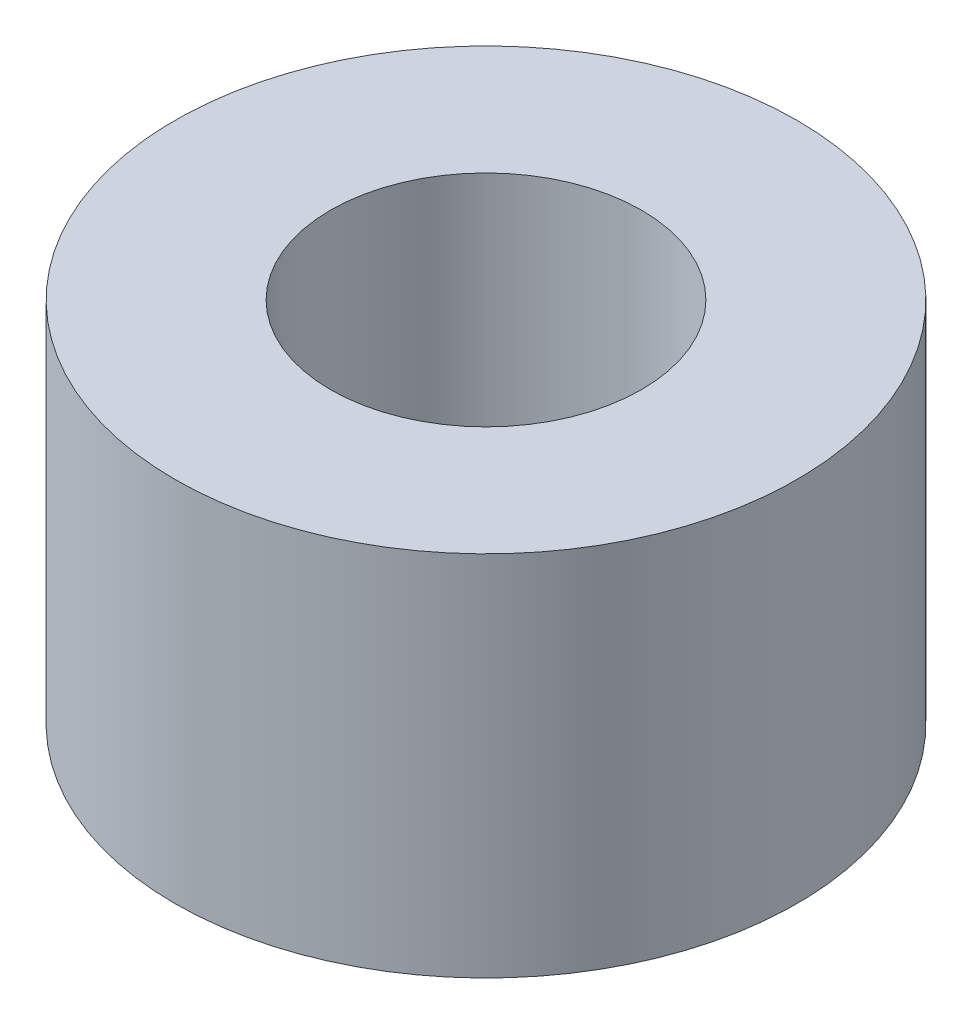
ISO-10303-21;
HEADER;
FILE_DESCRIPTION(('STEP AP214'),'2;1');
FILE_NAME('part.step','',(''),(''),'','','');
FILE_SCHEMA(('AUTOMOTIVE_DESIGN { 1 0 10303 214 1 1 1 1 }'));
ENDSEC;
DATA;
#1=APPLICATION_CONTEXT('core data for automotive mechanical design processes');
#2=APPLICATION_PROTOCOL_DEFINITION('international standard','automotive_design',2000,#1);
#3=PRODUCT_CONTEXT('',#1,'mechanical');
#4=PRODUCT('Part','Part','',(#3));
#5=PRODUCT_RELATED_PRODUCT_CATEGORY('part','',(#4));
#6=PRODUCT_DEFINITION_FORMATION('','',#4);
#7=PRODUCT_DEFINITION_CONTEXT('part definition',#1,'design');
#8=PRODUCT_DEFINITION('design','',#6,#7);
#9=PRODUCT_DEFINITION_SHAPE('','',#8);
#10=(LENGTH_UNIT() NAMED_UNIT(*) SI_UNIT(.MILLI.,.METRE.));
#11=(NAMED_UNIT(*) PLANE_ANGLE_UNIT() SI_UNIT($,.RADIAN.));
#12=(NAMED_UNIT(*) SI_UNIT($,.STERADIAN.) SOLID_ANGLE_UNIT());
#13=UNCERTAINTY_MEASURE_WITH_UNIT(LENGTH_MEASURE(1.E-05),#10,'distance_accuracy_value','');
#14=(GEOMETRIC_REPRESENTATION_CONTEXT(3) GLOBAL_UNCERTAINTY_ASSIGNED_CONTEXT((#13)) GLOBAL_UNIT_ASSIGNED_CONTEXT((#10,
#11,#12)) REPRESENTATION_CONTEXT('',''));
#15=CARTESIAN_POINT('',(0.,0.,0.));
#16=DIRECTION('',(0.,0.,1.));
#17=DIRECTION('',(1.,0.,0.));
#18=AXIS2_PLACEMENT_3D('',#15,#16,#17);
#19=CARTESIAN_POINT('',(0.,15.,0.));
#20=DIRECTION('',(0.,1.,0.));
#21=DIRECTION('',(0.,0.,1.));
#22=AXIS2_PLACEMENT_3D('',#19,#20,#21);
#23=PLANE('',#22);
#24=CARTESIAN_POINT('',(0.,15.,0.));
#25=DIRECTION('',(0.,1.,0.));
#26=DIRECTION('',(0.,0.,1.));
#27=AXIS2_PLACEMENT_3D('',#24,#25,#26);
#28=CIRCLE('',#27,12.7);
#29=CARTESIAN_POINT('',(0.,15.,12.7));
#30=VERTEX_POINT('',#29);
#31=EDGE_CURVE('E10',#30,#30,#28,.T.);
#32=ORIENTED_EDGE('',*,*,#31,.T.);
#33=EDGE_LOOP('',(#32));
#34=FACE_BOUND('',#33,.T.);
#35=CARTESIAN_POINT('',(0.,15.,0.));
#36=DIRECTION('',(0.,1.,0.));
#37=DIRECTION('',(0.,0.,1.));
#38=AXIS2_PLACEMENT_3D('',#35,#36,#37);
#39=CIRCLE('',#38,6.35);
#40=CARTESIAN_POINT('',(0.,15.,6.35));
#41=VERTEX_POINT('',#40);
#42=EDGE_CURVE('E56',#41,#41,#39,.T.);
#43=ORIENTED_EDGE('',*,*,#42,.F.);
#44=EDGE_LOOP('',(#43));
#45=FACE_BOUND('',#44,.T.);
#46=ADVANCED_FACE('F43',(#34,#45),#23,.T.);
#47=CARTESIAN_POINT('',(0.,0.,0.));
#48=DIRECTION('',(0.,1.,0.));
#49=DIRECTION('',(0.,0.,1.));
#50=AXIS2_PLACEMENT_3D('',#47,#48,#49);
#51=PLANE('',#50);
#52=CARTESIAN_POINT('',(0.,0.,0.));
#53=DIRECTION('',(0.,1.,0.));
#54=DIRECTION('',(0.,0.,1.));
#55=AXIS2_PLACEMENT_3D('',#52,#53,#54);
#56=CIRCLE('',#55,12.7);
#57=CARTESIAN_POINT('',(0.,0.,12.7));
#58=VERTEX_POINT('',#57);
#59=EDGE_CURVE('E47',#58,#58,#56,.T.);
#60=ORIENTED_EDGE('',*,*,#59,.F.);
#61=EDGE_LOOP('',(#60));
#62=FACE_BOUND('',#61,.T.);
#63=CARTESIAN_POINT('',(0.,0.,0.));
#64=DIRECTION('',(0.,1.,0.));
#65=DIRECTION('',(0.,0.,1.));
#66=AXIS2_PLACEMENT_3D('',#63,#64,#65);
#67=CIRCLE('',#66,6.35);
#68=CARTESIAN_POINT('',(0.,0.,6.35));
#69=VERTEX_POINT('',#68);
#70=EDGE_CURVE('E58',#69,#69,#67,.T.);
#71=ORIENTED_EDGE('',*,*,#70,.T.);
#72=EDGE_LOOP('',(#71));
#73=FACE_BOUND('',#72,.T.);
#74=ADVANCED_FACE('F70',(#62,#73),#51,.F.);
#75=CARTESIAN_POINT('',(0.,15.,0.));
#76=DIRECTION('',(0.,-1.,0.));
#77=DIRECTION('',(0.,0.,-1.));
#78=AXIS2_PLACEMENT_3D('',#75,#76,#77);
#79=CYLINDRICAL_SURFACE('',#78,12.7);
#80=ORIENTED_EDGE('',*,*,#31,.F.);
#81=EDGE_LOOP('',(#80));
#82=FACE_BOUND('',#81,.T.);
#83=ORIENTED_EDGE('',*,*,#59,.T.);
#84=EDGE_LOOP('',(#83));
#85=FACE_BOUND('',#84,.T.);
#86=ADVANCED_FACE('F45',(#82,#85),#79,.T.);
#87=CARTESIAN_POINT('',(0.,15.,0.));
#88=DIRECTION('',(0.,-1.,0.));
#89=DIRECTION('',(0.,0.,-1.));
#90=AXIS2_PLACEMENT_3D('',#87,#88,#89);
#91=CYLINDRICAL_SURFACE('',#90,6.35);
#92=ORIENTED_EDGE('',*,*,#42,.T.);
#93=EDGE_LOOP('',(#92));
#94=FACE_BOUND('',#93,.T.);
#95=ORIENTED_EDGE('',*,*,#70,.F.);
#96=EDGE_LOOP('',(#95));
#97=FACE_BOUND('',#96,.T.);
#98=ADVANCED_FACE('F66',(#94,#97),#91,.F.);
#99=CLOSED_SHELL('',(#46,#74,#86,#98));
#100=MANIFOLD_SOLID_BREP('B2',#99);
#101=ADVANCED_BREP_SHAPE_REPRESENTATION('',(#18,#100),#14);
#102=SHAPE_DEFINITION_REPRESENTATION(#9,#101);
ENDSEC;
END-ISO-10303-21;
